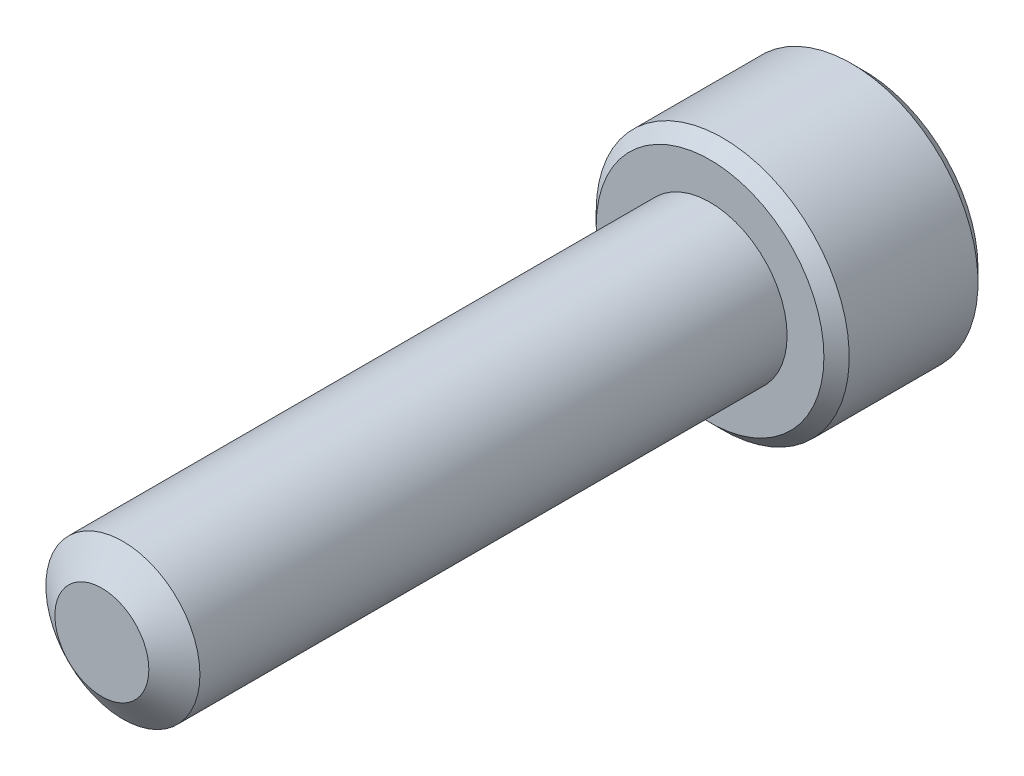
ISO-10303-21;
HEADER;
FILE_DESCRIPTION(('STEP AP214'),'2;1');
FILE_NAME('part.step','',(''),(''),'','','');
FILE_SCHEMA(('AUTOMOTIVE_DESIGN { 1 0 10303 214 1 1 1 1 }'));
ENDSEC;
DATA;
#1=APPLICATION_CONTEXT('core data for automotive mechanical design processes');
#2=APPLICATION_PROTOCOL_DEFINITION('international standard','automotive_design',2000,#1);
#3=PRODUCT_CONTEXT('',#1,'mechanical');
#4=PRODUCT('Part','Part','',(#3));
#5=PRODUCT_RELATED_PRODUCT_CATEGORY('part','',(#4));
#6=PRODUCT_DEFINITION_FORMATION('','',#4);
#7=PRODUCT_DEFINITION_CONTEXT('part definition',#1,'design');
#8=PRODUCT_DEFINITION('design','',#6,#7);
#9=PRODUCT_DEFINITION_SHAPE('','',#8);
#10=(LENGTH_UNIT() NAMED_UNIT(*) SI_UNIT(.MILLI.,.METRE.));
#11=(NAMED_UNIT(*) PLANE_ANGLE_UNIT() SI_UNIT($,.RADIAN.));
#12=(NAMED_UNIT(*) SI_UNIT($,.STERADIAN.) SOLID_ANGLE_UNIT());
#13=UNCERTAINTY_MEASURE_WITH_UNIT(LENGTH_MEASURE(1.E-05),#10,'distance_accuracy_value','');
#14=(GEOMETRIC_REPRESENTATION_CONTEXT(3) GLOBAL_UNCERTAINTY_ASSIGNED_CONTEXT((#13)) GLOBAL_UNIT_ASSIGNED_CONTEXT((#10,
#11,#12)) REPRESENTATION_CONTEXT('',''));
#15=CARTESIAN_POINT('',(0.,0.,0.));
#16=DIRECTION('',(0.,0.,1.));
#17=DIRECTION('',(1.,0.,0.));
#18=AXIS2_PLACEMENT_3D('',#15,#16,#17);
#19=CARTESIAN_POINT('',(0.,0.,-19.05));
#20=DIRECTION('',(0.,0.,1.));
#21=DIRECTION('',(1.,0.,0.));
#22=AXIS2_PLACEMENT_3D('',#19,#20,#21);
#23=CYLINDRICAL_SURFACE('',#22,2.413);
#24=CARTESIAN_POINT('',(0.,0.,-19.05));
#25=DIRECTION('',(0.,0.,-1.));
#26=DIRECTION('',(-1.,0.,0.));
#27=AXIS2_PLACEMENT_3D('',#24,#25,#26);
#28=CIRCLE('',#27,2.413);
#29=CARTESIAN_POINT('',(2.413,0.,-19.05));
#30=VERTEX_POINT('',#29);
#31=EDGE_CURVE('E236',#30,#30,#28,.F.);
#32=CARTESIAN_POINT('',(0.,0.,-0.659180743038974));
#33=DIRECTION('',(0.,0.,1.));
#34=DIRECTION('',(1.,0.,0.));
#35=AXIS2_PLACEMENT_3D('',#32,#33,#34);
#36=CIRCLE('',#35,2.413);
#37=CARTESIAN_POINT('',(2.413,0.,-0.659180743038973));
#38=VERTEX_POINT('',#37);
#39=EDGE_CURVE('E125',#38,#38,#36,.T.);
#40=CARTESIAN_POINT('',(2.413,0.,-19.05));
#41=CARTESIAN_POINT('',(2.413,0.,-18.8584289660733));
#42=CARTESIAN_POINT('',(2.413,0.,-18.6668579321466));
#43=CARTESIAN_POINT('',(2.413,0.,-18.2837158642933));
#44=CARTESIAN_POINT('',(2.413,0.,-18.0921448303666));
#45=CARTESIAN_POINT('',(2.413,0.,-17.7090027625133));
#46=CARTESIAN_POINT('',(2.413,0.,-17.5174317285866));
#47=CARTESIAN_POINT('',(2.413,0.,-17.1342896607332));
#48=CARTESIAN_POINT('',(2.413,0.,-16.9427186268065));
#49=CARTESIAN_POINT('',(2.413,0.,-16.5595765589532));
#50=CARTESIAN_POINT('',(2.413,0.,-16.3680055250265));
#51=CARTESIAN_POINT('',(2.413,0.,-15.9848634571732));
#52=CARTESIAN_POINT('',(2.413,0.,-15.7932924232465));
#53=CARTESIAN_POINT('',(2.413,0.,-15.4101503553931));
#54=CARTESIAN_POINT('',(2.413,0.,-15.2185793214665));
#55=CARTESIAN_POINT('',(2.413,0.,-14.8354372536131));
#56=CARTESIAN_POINT('',(2.413,0.,-14.6438662196864));
#57=CARTESIAN_POINT('',(2.413,0.,-14.2607241518331));
#58=CARTESIAN_POINT('',(2.413,0.,-14.0691531179064));
#59=CARTESIAN_POINT('',(2.413,0.,-13.686011050053));
#60=CARTESIAN_POINT('',(2.413,0.,-13.4944400161264));
#61=CARTESIAN_POINT('',(2.413,0.,-13.111297948273));
#62=CARTESIAN_POINT('',(2.413,0.,-12.9197269143463));
#63=CARTESIAN_POINT('',(2.413,0.,-12.536584846493));
#64=CARTESIAN_POINT('',(2.413,0.,-12.3450138125663));
#65=CARTESIAN_POINT('',(2.413,0.,-11.9618717447129));
#66=CARTESIAN_POINT('',(2.413,0.,-11.7703007107863));
#67=CARTESIAN_POINT('',(2.413,0.,-11.3871586429329));
#68=CARTESIAN_POINT('',(2.413,0.,-11.1955876090062));
#69=CARTESIAN_POINT('',(2.413,0.,-10.8124455411529));
#70=CARTESIAN_POINT('',(2.413,0.,-10.6208745072262));
#71=CARTESIAN_POINT('',(2.413,0.,-10.2377324393728));
#72=CARTESIAN_POINT('',(2.413,0.,-10.0461614054462));
#73=CARTESIAN_POINT('',(2.413,0.,-9.66301933759281));
#74=CARTESIAN_POINT('',(2.413,0.,-9.47144830366613));
#75=CARTESIAN_POINT('',(2.413,0.,-9.08830623581278));
#76=CARTESIAN_POINT('',(2.413,0.,-8.8967352018861));
#77=CARTESIAN_POINT('',(2.413,0.,-8.51359313403274));
#78=CARTESIAN_POINT('',(2.413,0.,-8.32202210010607));
#79=CARTESIAN_POINT('',(2.413,0.,-7.93888003225271));
#80=CARTESIAN_POINT('',(2.413,0.,-7.74730899832604));
#81=CARTESIAN_POINT('',(2.413,0.,-7.36416693047268));
#82=CARTESIAN_POINT('',(2.413,0.,-7.172595896546));
#83=CARTESIAN_POINT('',(2.413,0.,-6.78945382869265));
#84=CARTESIAN_POINT('',(2.413,0.,-6.59788279476597));
#85=CARTESIAN_POINT('',(2.413,0.,-6.21474072691262));
#86=CARTESIAN_POINT('',(2.413,0.,-6.02316969298594));
#87=CARTESIAN_POINT('',(2.413,0.,-5.64002762513258));
#88=CARTESIAN_POINT('',(2.413,0.,-5.44845659120591));
#89=CARTESIAN_POINT('',(2.413,0.,-5.06531452335255));
#90=CARTESIAN_POINT('',(2.413,0.,-4.87374348942588));
#91=CARTESIAN_POINT('',(2.413,0.,-4.49060142157252));
#92=CARTESIAN_POINT('',(2.413,0.,-4.29903038764584));
#93=CARTESIAN_POINT('',(2.413,0.,-3.91588831979249));
#94=CARTESIAN_POINT('',(2.413,0.,-3.72431728586581));
#95=CARTESIAN_POINT('',(2.413,0.,-3.34117521801246));
#96=CARTESIAN_POINT('',(2.413,0.,-3.14960418408578));
#97=CARTESIAN_POINT('',(2.413,0.,-2.76646211623243));
#98=CARTESIAN_POINT('',(2.413,0.,-2.57489108230575));
#99=CARTESIAN_POINT('',(2.413,0.,-2.19174901445239));
#100=CARTESIAN_POINT('',(2.413,0.,-2.00017798052571));
#101=CARTESIAN_POINT('',(2.413,0.,-1.61703591267236));
#102=CARTESIAN_POINT('',(2.413,0.,-1.42546487874568));
#103=CARTESIAN_POINT('',(2.413,0.,-1.04232281089233));
#104=CARTESIAN_POINT('',(2.413,0.,-0.850751776965651));
#105=CARTESIAN_POINT('',(2.413,0.,-0.659180743038973));
#106=B_SPLINE_CURVE_WITH_KNOTS('',3,(#40,#41,#42,#43,#44,#45,#46,#47,#48,#49,#50,#51,#52,#53,
#54,#55,#56,#57,#58,#59,#60,#61,#62,#63,#64,#65,#66,#67,#68,#69,#70,#71,#72,#73,#74,#75,#76,#77,
#78,#79,#80,#81,#82,#83,#84,#85,#86,#87,#88,#89,#90,#91,#92,#93,#94,#95,#96,#97,#98,#99,#100,
#101,#102,#103,#104,#105),.UNSPECIFIED.,.F.,.F.,(4,2,2,2,2,2,2,2,2,2,2,2,2,2,2,2,2,2,2,2,2,2,2,
2,2,2,2,2,2,2,2,2,4),(0.,0.57471310178003,1.14942620356006,1.72413930534009,2.29885240712013,
2.87356550890016,3.44827861068019,4.02299171246022,4.59770481424025,5.17241791602029,
5.74713101780032,6.32184411958035,6.89655722136038,7.47127032314042,8.04598342492045,
8.62069652670048,9.19540962848051,9.77012273026054,10.3448358320406,10.9195489338206,
11.4942620356006,12.0689751373807,12.6436882391607,13.2184013409407,13.7931144427208,
14.3678275445008,14.9425406462808,15.5172537480609,16.0919668498409,16.6666799516209,
17.241393053401,17.816106155181,18.390819256961),.UNSPECIFIED.);
#107=EDGE_CURVE('BSEAM40',#30,#38,#106,.T.);
#108=ORIENTED_EDGE('',*,*,#31,.T.);
#109=ORIENTED_EDGE('',*,*,#39,.F.);
#110=ORIENTED_EDGE('',*,*,#107,.T.);
#111=ORIENTED_EDGE('',*,*,#107,.F.);
#112=EDGE_LOOP('',(#108,#110,#109,#111));
#113=FACE_BOUND('',#112,.T.);
#114=ADVANCED_FACE('F40',(#113),#23,.T.);
#115=CARTESIAN_POINT('',(0.,0.,0.));
#116=DIRECTION('',(0.,0.,-1.));
#117=DIRECTION('',(-1.,0.,0.));
#118=AXIS2_PLACEMENT_3D('',#115,#116,#117);
#119=CONICAL_SURFACE('',#118,1.4715923357461,0.959931088596884);
#120=ORIENTED_EDGE('',*,*,#39,.T.);
#121=EDGE_LOOP('',(#120));
#122=FACE_BOUND('',#121,.T.);
#123=CARTESIAN_POINT('',(0.,0.,0.));
#124=DIRECTION('',(0.,0.,1.));
#125=DIRECTION('',(1.,0.,0.));
#126=AXIS2_PLACEMENT_3D('',#123,#124,#125);
#127=CIRCLE('',#126,1.4715923357461);
#128=CARTESIAN_POINT('',(1.4715923357461,0.,0.));
#129=VERTEX_POINT('',#128);
#130=EDGE_CURVE('E234',#129,#129,#127,.T.);
#131=ORIENTED_EDGE('',*,*,#130,.F.);
#132=EDGE_LOOP('',(#131));
#133=FACE_BOUND('',#132,.T.);
#134=ADVANCED_FACE('F217',(#122,#133),#119,.T.);
#135=CARTESIAN_POINT('',(0.,0.,0.));
#136=DIRECTION('',(0.,0.,1.));
#137=DIRECTION('',(1.,0.,0.));
#138=AXIS2_PLACEMENT_3D('',#135,#136,#137);
#139=PLANE('',#138);
#140=ORIENTED_EDGE('',*,*,#130,.T.);
#141=EDGE_LOOP('',(#140));
#142=FACE_BOUND('',#141,.T.);
#143=ADVANCED_FACE('F214',(#142),#139,.T.);
#144=CARTESIAN_POINT('',(0.,0.,-23.876));
#145=DIRECTION('',(0.,0.,1.));
#146=DIRECTION('',(1.,0.,0.));
#147=AXIS2_PLACEMENT_3D('',#144,#145,#146);
#148=CYLINDRICAL_SURFACE('',#147,3.9624);
#149=CARTESIAN_POINT('',(0.,0.,-23.47976));
#150=DIRECTION('',(0.,0.,-1.));
#151=DIRECTION('',(-1.,0.,0.));
#152=AXIS2_PLACEMENT_3D('',#149,#150,#151);
#153=CIRCLE('',#152,3.9624);
#154=CARTESIAN_POINT('',(-3.9624,0.,-23.47976));
#155=VERTEX_POINT('',#154);
#156=EDGE_CURVE('E49',#155,#155,#153,.F.);
#157=ORIENTED_EDGE('',*,*,#156,.T.);
#158=EDGE_LOOP('',(#157));
#159=FACE_BOUND('',#158,.T.);
#160=CARTESIAN_POINT('',(0.,0.,-19.44624));
#161=DIRECTION('',(0.,0.,-1.));
#162=DIRECTION('',(-1.,0.,0.));
#163=AXIS2_PLACEMENT_3D('',#160,#161,#162);
#164=CIRCLE('',#163,3.9624);
#165=CARTESIAN_POINT('',(-3.9624,0.,-19.44624));
#166=VERTEX_POINT('',#165);
#167=EDGE_CURVE('E190',#166,#166,#164,.T.);
#168=ORIENTED_EDGE('',*,*,#167,.T.);
#169=EDGE_LOOP('',(#168));
#170=FACE_BOUND('',#169,.T.);
#171=ADVANCED_FACE('F198',(#159,#170),#148,.T.);
#172=CARTESIAN_POINT('',(0.,0.,-23.876));
#173=DIRECTION('',(0.,0.,-1.));
#174=DIRECTION('',(-1.,0.,0.));
#175=AXIS2_PLACEMENT_3D('',#172,#173,#174);
#176=PLANE('',#175);
#177=CARTESIAN_POINT('',(0.,0.,-23.876));
#178=DIRECTION('',(0.,0.,-1.));
#179=DIRECTION('',(-1.,0.,0.));
#180=AXIS2_PLACEMENT_3D('',#177,#178,#179);
#181=CIRCLE('',#180,3.56616);
#182=CARTESIAN_POINT('',(-3.56616,0.,-23.876));
#183=VERTEX_POINT('',#182);
#184=EDGE_CURVE('E124',#183,#183,#181,.T.);
#185=ORIENTED_EDGE('',*,*,#184,.T.);
#186=EDGE_LOOP('',(#185));
#187=FACE_BOUND('',#186,.T.);
#188=CARTESIAN_POINT('',(0.,0.,-23.876));
#189=DIRECTION('',(0.,0.,-1.));
#190=DIRECTION('',(-1.,0.,0.));
#191=AXIS2_PLACEMENT_3D('',#188,#189,#190);
#192=CIRCLE('',#191,2.29135888084633);
#193=CARTESIAN_POINT('',(-1.984375,1.14567944042316,-23.876));
#194=VERTEX_POINT('',#193);
#195=CARTESIAN_POINT('',(0.,2.29135888084633,-23.876));
#196=VERTEX_POINT('',#195);
#197=EDGE_CURVE('E104',#194,#196,#192,.T.);
#198=ORIENTED_EDGE('',*,*,#197,.F.);
#199=CARTESIAN_POINT('',(-1.984375,-1.14567944042316,-23.876));
#200=VERTEX_POINT('',#199);
#201=EDGE_CURVE('E55',#200,#194,#192,.T.);
#202=ORIENTED_EDGE('',*,*,#201,.F.);
#203=CARTESIAN_POINT('',(0.,-2.29135888084633,-23.876));
#204=VERTEX_POINT('',#203);
#205=EDGE_CURVE('E303',#204,#200,#192,.T.);
#206=ORIENTED_EDGE('',*,*,#205,.F.);
#207=CARTESIAN_POINT('',(1.984375,-1.14567944042316,-23.876));
#208=VERTEX_POINT('',#207);
#209=EDGE_CURVE('E65',#208,#204,#192,.T.);
#210=ORIENTED_EDGE('',*,*,#209,.F.);
#211=CARTESIAN_POINT('',(1.984375,1.14567944042316,-23.876));
#212=VERTEX_POINT('',#211);
#213=EDGE_CURVE('E147',#212,#208,#192,.T.);
#214=ORIENTED_EDGE('',*,*,#213,.F.);
#215=EDGE_CURVE('E113',#196,#212,#192,.T.);
#216=ORIENTED_EDGE('',*,*,#215,.F.);
#217=EDGE_LOOP('',(#198,#202,#206,#210,#214,#216));
#218=FACE_BOUND('',#217,.T.);
#219=ADVANCED_FACE('F146',(#187,#218),#176,.T.);
#220=CARTESIAN_POINT('',(0.,0.,-19.05));
#221=DIRECTION('',(0.,0.,-1.));
#222=DIRECTION('',(-1.,0.,0.));
#223=AXIS2_PLACEMENT_3D('',#220,#221,#222);
#224=PLANE('',#223);
#225=CARTESIAN_POINT('',(0.,0.,-19.05));
#226=DIRECTION('',(0.,0.,-1.));
#227=DIRECTION('',(-1.,0.,0.));
#228=AXIS2_PLACEMENT_3D('',#225,#226,#227);
#229=CIRCLE('',#228,3.56616);
#230=CARTESIAN_POINT('',(-3.56616,0.,-19.05));
#231=VERTEX_POINT('',#230);
#232=EDGE_CURVE('E11',#231,#231,#229,.F.);
#233=ORIENTED_EDGE('',*,*,#232,.T.);
#234=EDGE_LOOP('',(#233));
#235=FACE_BOUND('',#234,.T.);
#236=ORIENTED_EDGE('',*,*,#31,.F.);
#237=EDGE_LOOP('',(#236));
#238=FACE_BOUND('',#237,.T.);
#239=ADVANCED_FACE('F207',(#235,#238),#224,.F.);
#240=CARTESIAN_POINT('',(0.,0.,-23.876));
#241=DIRECTION('',(0.,0.,-1.));
#242=DIRECTION('',(-1.,0.,0.));
#243=AXIS2_PLACEMENT_3D('',#240,#241,#242);
#244=CONICAL_SURFACE('',#243,2.29135888084633,0.78539816339745);
#245=ORIENTED_EDGE('',*,*,#215,.T.);
#246=CARTESIAN_POINT('',(-0.000199999999999771,2.29147435090016,-23.8761154787818));
#247=CARTESIAN_POINT('',(0.0680159951668028,2.25208982772757,-23.8367628522639));
#248=CARTESIAN_POINT('',(0.137372685106966,2.21204672412052,-23.7997213104462));
#249=CARTESIAN_POINT('',(0.278798800452187,2.13039431835551,-23.7318988584233));
#250=CARTESIAN_POINT('',(0.350881678736782,2.08877724917394,-23.7011556890918));
#251=CARTESIAN_POINT('',(0.496233397266003,2.00485839535392,-23.6484918888112));
#252=CARTESIAN_POINT('',(0.569465212486937,1.96257798712287,-23.62643887588));
#253=CARTESIAN_POINT('',(0.717541182594705,1.87708628592063,-23.5924614929439));
#254=CARTESIAN_POINT('',(0.792380812753423,1.83387760530244,-23.5805117560917));
#255=CARTESIAN_POINT('',(0.921360414543814,1.75941119748879,-23.5697300990819));
#256=CARTESIAN_POINT('',(0.975333715772441,1.72824969749539,-23.5681338990591));
#257=CARTESIAN_POINT('',(1.0831921185198,1.66597761963484,-23.5708218388653));
#258=CARTESIAN_POINT('',(1.13707718248552,1.63486706344893,-23.5751080403405));
#259=CARTESIAN_POINT('',(1.2443385382486,1.57293969082547,-23.5893168730135));
#260=CARTESIAN_POINT('',(1.29771419276014,1.54212324232506,-23.5992458104523));
#261=CARTESIAN_POINT('',(1.40354251740889,1.48102323060122,-23.6241950842745));
#262=CARTESIAN_POINT('',(1.4559952579711,1.45073962671789,-23.6392150303895));
#263=CARTESIAN_POINT('',(1.59035733896365,1.37316564308797,-23.6838078516357));
#264=CARTESIAN_POINT('',(1.67143335715832,1.32635638215845,-23.7167429959383));
#265=CARTESIAN_POINT('',(1.79064830672984,1.25752759893191,-23.7723424412022));
#266=CARTESIAN_POINT('',(1.829934924386,1.23484545965257,-23.7918775920519));
#267=CARTESIAN_POINT('',(1.90778036186805,1.18990137536713,-23.8327287381194));
#268=CARTESIAN_POINT('',(1.9463396111017,1.16763918244233,-23.8540436395684));
#269=CARTESIAN_POINT('',(1.984575,1.14556397036933,-23.8761154787818));
#270=B_SPLINE_CURVE_WITH_KNOTS('',3,(#246,#247,#248,#249,#250,#251,#252,#253,#254,#255,#256,
#257,#258,#259,#260,#261,#262,#263,#264,#265,#266,#267,#268,#269),.UNSPECIFIED.,.F.,.F.,(4,2,2,
2,2,2,2,2,2,2,2,4),(0.,0.264339630306627,0.530219665093693,0.791876416371459,1.05287424418109,
1.239639843932,1.42647091743852,1.61351120244034,1.8005371524754,2.09764209964316,
2.24579179873713,2.39385111134157),.UNSPECIFIED.);
#271=EDGE_CURVE('E118',#196,#212,#270,.T.);
#272=ORIENTED_EDGE('',*,*,#271,.F.);
#273=EDGE_LOOP('',(#245,#272));
#274=FACE_BOUND('',#273,.T.);
#275=ADVANCED_FACE('F119',(#274),#244,.F.);
#276=ORIENTED_EDGE('',*,*,#213,.T.);
#277=CARTESIAN_POINT('',(1.984375,-2.28495242157823,-24.6109840788166));
#278=CARTESIAN_POINT('',(1.984375,-2.22931635455402,-24.5689866855508));
#279=CARTESIAN_POINT('',(1.984375,-2.17336876548389,-24.5273960540763));
#280=CARTESIAN_POINT('',(1.984375,-2.06072770258171,-24.4452084614715));
#281=CARTESIAN_POINT('',(1.984375,-2.00403404503435,-24.404611752405));
#282=CARTESIAN_POINT('',(1.984375,-1.88936329173489,-24.3243035031747));
#283=CARTESIAN_POINT('',(1.984375,-1.83137965519348,-24.2846012588133));
#284=CARTESIAN_POINT('',(1.984375,-1.7144280213784,-24.2066851734013));
#285=CARTESIAN_POINT('',(1.984375,-1.65546009407228,-24.1684712271944));
#286=CARTESIAN_POINT('',(1.984375,-1.47005472306036,-24.0522528340136));
#287=CARTESIAN_POINT('',(1.984375,-1.34163909427884,-23.9773478868724));
#288=CARTESIAN_POINT('',(1.984375,-1.0784038470548,-23.8403302154397));
#289=CARTESIAN_POINT('',(1.984375,-0.943607781407426,-23.7781743664824));
#290=CARTESIAN_POINT('',(1.984375,-0.741275100444882,-23.7021325786886));
#291=CARTESIAN_POINT('',(1.984375,-0.676735408881095,-23.680308061326));
#292=CARTESIAN_POINT('',(1.984375,-0.546098118112762,-23.6418404635378));
#293=CARTESIAN_POINT('',(1.984375,-0.480000411919956,-23.6251977400655));
#294=CARTESIAN_POINT('',(1.984375,-0.347746170028533,-23.5982353808697));
#295=CARTESIAN_POINT('',(1.984375,-0.281612071479124,-23.5878074097359));
#296=CARTESIAN_POINT('',(1.984375,-0.148636620052352,-23.5734781473766));
#297=CARTESIAN_POINT('',(1.984375,-0.0817953907393255,-23.5695757342274));
#298=CARTESIAN_POINT('',(1.984375,0.0495156750890624,-23.5685870513327));
#299=CARTESIAN_POINT('',(1.984375,0.113983775102989,-23.571259178875));
#300=CARTESIAN_POINT('',(1.984375,0.242367515846175,-23.5827392104975));
#301=CARTESIAN_POINT('',(1.984375,0.306283102295918,-23.5915477106392));
#302=CARTESIAN_POINT('',(1.984375,0.434181040262183,-23.6149690213329));
#303=CARTESIAN_POINT('',(1.984375,0.498145026858309,-23.6296806062321));
#304=CARTESIAN_POINT('',(1.984375,0.624675616953007,-23.6641261814121));
#305=CARTESIAN_POINT('',(1.984375,0.687242336899688,-23.6838597514492));
#306=CARTESIAN_POINT('',(1.984375,0.884225483826088,-23.7534122372308));
#307=CARTESIAN_POINT('',(1.984375,1.01583674256468,-23.8111524112565));
#308=CARTESIAN_POINT('',(1.984375,1.27288659242652,-23.9395303365888));
#309=CARTESIAN_POINT('',(1.984375,1.3983008827048,-24.0102144249194));
#310=CARTESIAN_POINT('',(1.984375,1.57956687990221,-24.1205166638132));
#311=CARTESIAN_POINT('',(1.984375,1.63738271299424,-24.1569698294754));
#312=CARTESIAN_POINT('',(1.984375,1.75202215386202,-24.2314159632917));
#313=CARTESIAN_POINT('',(1.984375,1.80884568601362,-24.2694090480781));
#314=CARTESIAN_POINT('',(1.984375,1.92116923084255,-24.3463388088931));
#315=CARTESIAN_POINT('',(1.984375,1.97667624512253,-24.3852653130388));
#316=CARTESIAN_POINT('',(1.984375,2.08693170717166,-24.4641477461214));
#317=CARTESIAN_POINT('',(1.984375,2.14168035934792,-24.504103389024));
#318=CARTESIAN_POINT('',(1.984375,2.19611149046622,-24.5444806112854));
#319=B_SPLINE_CURVE_WITH_KNOTS('',3,(#277,#278,#279,#280,#281,#282,#283,#284,#285,#286,#287,
#288,#289,#290,#291,#292,#293,#294,#295,#296,#297,#298,#299,#300,#301,#302,#303,#304,#305,#306,
#307,#308,#309,#310,#311,#312,#313,#314,#315,#316,#317,#318),.UNSPECIFIED.,.F.,.F.,(4,2,2,2,2,2,
2,2,2,2,2,2,2,2,2,2,2,2,2,2,4),(0.,0.209126070008322,0.418304637356571,0.629103979977991,
0.839888401371184,1.28549951116127,1.72957750768351,1.93379389749972,2.13802435186698,
2.33858179514334,2.53910475350639,2.73236963400794,2.92565329006887,3.12231577097488,
3.31896180041345,3.74886295245172,4.18033428125363,4.3853601718029,4.59040161996383,
4.79377749165108,4.99709743524131),.UNSPECIFIED.);
#320=EDGE_CURVE('E112',#212,#208,#319,.F.);
#321=ORIENTED_EDGE('',*,*,#320,.F.);
#322=EDGE_LOOP('',(#276,#321));
#323=FACE_BOUND('',#322,.T.);
#324=ADVANCED_FACE('F312',(#323),#244,.F.);
#325=ORIENTED_EDGE('',*,*,#209,.T.);
#326=CARTESIAN_POINT('',(1.984575,-1.14556397036933,-23.8761154787818));
#327=CARTESIAN_POINT('',(1.9163590048332,-1.18494849354192,-23.8367628522639));
#328=CARTESIAN_POINT('',(1.84700231489303,-1.22499159714897,-23.7997213104462));
#329=CARTESIAN_POINT('',(1.70557619954781,-1.30664400291398,-23.7318988584233));
#330=CARTESIAN_POINT('',(1.63349332126322,-1.34826107209555,-23.7011556890918));
#331=CARTESIAN_POINT('',(1.488141602734,-1.43217992591557,-23.6484918888112));
#332=CARTESIAN_POINT('',(1.41490978751306,-1.47446033414662,-23.62643887588));
#333=CARTESIAN_POINT('',(1.2668338174053,-1.55995203534886,-23.5924614929439));
#334=CARTESIAN_POINT('',(1.19199418724658,-1.60316071596705,-23.5805117560917));
#335=CARTESIAN_POINT('',(1.06301458545619,-1.6776271237807,-23.5697300990819));
#336=CARTESIAN_POINT('',(1.00904128422756,-1.7087886237741,-23.5681338990591));
#337=CARTESIAN_POINT('',(0.901182881480201,-1.77106070163465,-23.5708218388653));
#338=CARTESIAN_POINT('',(0.847297817514478,-1.80217125782056,-23.5751080403405));
#339=CARTESIAN_POINT('',(0.740036461751398,-1.86409863044402,-23.5893168730135));
#340=CARTESIAN_POINT('',(0.686660807239861,-1.89491507894443,-23.5992458104523));
#341=CARTESIAN_POINT('',(0.580832482591105,-1.95601509066827,-23.6241950842745));
#342=CARTESIAN_POINT('',(0.5283797420289,-1.9862986945516,-23.6392150303895));
#343=CARTESIAN_POINT('',(0.394017661036353,-2.06387267818152,-23.6838078516357));
#344=CARTESIAN_POINT('',(0.312941642841678,-2.11068193911104,-23.7167429959383));
#345=CARTESIAN_POINT('',(0.193726693270162,-2.17951072233758,-23.7723424412022));
#346=CARTESIAN_POINT('',(0.154440075614,-2.20219286161692,-23.7918775920519));
#347=CARTESIAN_POINT('',(0.0765946381319483,-2.24713694590237,-23.8327287381194));
#348=CARTESIAN_POINT('',(0.0380353888983022,-2.26939913882716,-23.8540436395684));
#349=CARTESIAN_POINT('',(-0.000199999999999163,-2.29147435090017,-23.8761154787818));
#350=B_SPLINE_CURVE_WITH_KNOTS('',3,(#326,#327,#328,#329,#330,#331,#332,#333,#334,#335,#336,
#337,#338,#339,#340,#341,#342,#343,#344,#345,#346,#347,#348,#349),.UNSPECIFIED.,.F.,.F.,(4,2,2,
2,2,2,2,2,2,2,2,4),(0.,0.264339630306625,0.530219665093692,0.791876416371457,1.05287424418109,
1.239639843932,1.42647091743852,1.61351120244034,1.8005371524754,2.09764209964316,
2.24579179873713,2.39385111134157),.UNSPECIFIED.);
#351=EDGE_CURVE('E159',#208,#204,#350,.T.);
#352=ORIENTED_EDGE('',*,*,#351,.F.);
#353=EDGE_LOOP('',(#325,#352));
#354=FACE_BOUND('',#353,.T.);
#355=ADVANCED_FACE('F309',(#354),#244,.F.);
#356=ORIENTED_EDGE('',*,*,#205,.T.);
#357=CARTESIAN_POINT('',(0.000200000000000153,-2.29147435090017,-23.8761154787818));
#358=CARTESIAN_POINT('',(-0.0680159951668025,-2.25208982772757,-23.8367628522639));
#359=CARTESIAN_POINT('',(-0.137372685106966,-2.21204672412052,-23.7997213104462));
#360=CARTESIAN_POINT('',(-0.278798800452187,-2.13039431835551,-23.7318988584233));
#361=CARTESIAN_POINT('',(-0.350881678736782,-2.08877724917394,-23.7011556890918));
#362=CARTESIAN_POINT('',(-0.496233397266002,-2.00485839535392,-23.6484918888112));
#363=CARTESIAN_POINT('',(-0.569465212486937,-1.96257798712287,-23.62643887588));
#364=CARTESIAN_POINT('',(-0.717541182594704,-1.87708628592063,-23.5924614929439));
#365=CARTESIAN_POINT('',(-0.792380812753422,-1.83387760530244,-23.5805117560917));
#366=CARTESIAN_POINT('',(-0.921360414543813,-1.75941119748879,-23.5697300990819));
#367=CARTESIAN_POINT('',(-0.97533371577244,-1.72824969749539,-23.5681338990591));
#368=CARTESIAN_POINT('',(-1.0831921185198,-1.66597761963484,-23.5708218388653));
#369=CARTESIAN_POINT('',(-1.13707718248552,-1.63486706344893,-23.5751080403405));
#370=CARTESIAN_POINT('',(-1.2443385382486,-1.57293969082547,-23.5893168730135));
#371=CARTESIAN_POINT('',(-1.29771419276014,-1.54212324232506,-23.5992458104523));
#372=CARTESIAN_POINT('',(-1.40354251740889,-1.48102323060122,-23.6241950842745));
#373=CARTESIAN_POINT('',(-1.4559952579711,-1.45073962671789,-23.6392150303895));
#374=CARTESIAN_POINT('',(-1.59035733896365,-1.37316564308797,-23.6838078516357));
#375=CARTESIAN_POINT('',(-1.67143335715832,-1.32635638215845,-23.7167429959383));
#376=CARTESIAN_POINT('',(-1.79064830672984,-1.25752759893191,-23.7723424412022));
#377=CARTESIAN_POINT('',(-1.829934924386,-1.23484545965257,-23.7918775920519));
#378=CARTESIAN_POINT('',(-1.90778036186805,-1.18990137536713,-23.8327287381194));
#379=CARTESIAN_POINT('',(-1.9463396111017,-1.16763918244233,-23.8540436395684));
#380=CARTESIAN_POINT('',(-1.984575,-1.14556397036933,-23.8761154787818));
#381=B_SPLINE_CURVE_WITH_KNOTS('',3,(#357,#358,#359,#360,#361,#362,#363,#364,#365,#366,#367,
#368,#369,#370,#371,#372,#373,#374,#375,#376,#377,#378,#379,#380),.UNSPECIFIED.,.F.,.F.,(4,2,2,
2,2,2,2,2,2,2,2,4),(0.,0.264339630306627,0.530219665093693,0.791876416371457,1.05287424418109,
1.239639843932,1.42647091743852,1.61351120244034,1.8005371524754,2.09764209964316,
2.24579179873713,2.39385111134157),.UNSPECIFIED.);
#382=EDGE_CURVE('E281',#204,#200,#381,.T.);
#383=ORIENTED_EDGE('',*,*,#382,.F.);
#384=EDGE_LOOP('',(#356,#383));
#385=FACE_BOUND('',#384,.T.);
#386=ADVANCED_FACE('F318',(#385),#244,.F.);
#387=ORIENTED_EDGE('',*,*,#201,.T.);
#388=CARTESIAN_POINT('',(-1.984375,-2.28495242191067,-24.6109840790676));
#389=CARTESIAN_POINT('',(-1.984375,-2.22931635487714,-24.5689866857921));
#390=CARTESIAN_POINT('',(-1.984375,-2.17336876579765,-24.527396054308));
#391=CARTESIAN_POINT('',(-1.984375,-2.06072770287666,-24.4452084616839));
#392=CARTESIAN_POINT('',(-1.984375,-2.00403404531985,-24.4046117526079));
#393=CARTESIAN_POINT('',(-1.984375,-1.88936329200117,-24.3243035033582));
#394=CARTESIAN_POINT('',(-1.984375,-1.83137965544999,-24.2846012589872));
#395=CARTESIAN_POINT('',(-1.984375,-1.71442802161519,-24.206685173556));
#396=CARTESIAN_POINT('',(-1.984375,-1.65546009429911,-24.1684712273396));
#397=CARTESIAN_POINT('',(-1.984375,-1.47005472325436,-24.0522528341287));
#398=CARTESIAN_POINT('',(-1.984375,-1.34163909444949,-23.9773478869673));
#399=CARTESIAN_POINT('',(-1.984375,-1.07840384717678,-23.8403302154972));
#400=CARTESIAN_POINT('',(-1.984375,-0.943607781504097,-23.7781743665226));
#401=CARTESIAN_POINT('',(-1.984375,-0.741275100522509,-23.702132578716));
#402=CARTESIAN_POINT('',(-1.984375,-0.676735408966697,-23.6803080613539));
#403=CARTESIAN_POINT('',(-1.984375,-0.546098118214576,-23.6418404635651));
#404=CARTESIAN_POINT('',(-1.984375,-0.480000412030006,-23.6251977400917));
#405=CARTESIAN_POINT('',(-1.984375,-0.347746170154783,-23.5982353808918));
#406=CARTESIAN_POINT('',(-1.984375,-0.281612071613335,-23.587807409755));
#407=CARTESIAN_POINT('',(-1.984375,-0.148636620202218,-23.5734781473881));
#408=CARTESIAN_POINT('',(-1.984375,-0.0817953908968865,-23.5695757342341));
#409=CARTESIAN_POINT('',(-1.984375,0.0495156749173046,-23.5685870513286));
#410=CARTESIAN_POINT('',(-1.984375,0.113983774924709,-23.571259178865));
#411=CARTESIAN_POINT('',(-1.984375,0.242367515655503,-23.5827392104746));
#412=CARTESIAN_POINT('',(-1.984375,0.306283102099376,-23.5915477106094));
#413=CARTESIAN_POINT('',(-1.984375,0.434181040054053,-23.6149690212885));
#414=CARTESIAN_POINT('',(-1.984375,0.498145026644478,-23.6296806061801));
#415=CARTESIAN_POINT('',(-1.984375,0.624675616728326,-23.6641261813447));
#416=CARTESIAN_POINT('',(-1.984375,0.687242336669858,-23.683859751374));
#417=CARTESIAN_POINT('',(-1.984375,0.884225483546212,-23.7534122371189));
#418=CARTESIAN_POINT('',(-1.984375,1.01583674224242,-23.8111524111108));
#419=CARTESIAN_POINT('',(-1.984375,1.27288659202273,-23.9395303363718));
#420=CARTESIAN_POINT('',(-1.984375,1.3983008822619,-24.0102144246649));
#421=CARTESIAN_POINT('',(-1.984375,1.57956687940504,-24.1205166635036));
#422=CARTESIAN_POINT('',(-1.984375,1.63738271248118,-24.1569698291489));
#423=CARTESIAN_POINT('',(-1.984375,1.75202215331742,-24.2314159629313));
#424=CARTESIAN_POINT('',(-1.984375,1.80884568545336,-24.2694090477007));
#425=CARTESIAN_POINT('',(-1.984375,1.92116923025136,-24.3463388084819));
#426=CARTESIAN_POINT('',(-1.984375,1.97667624451606,-24.3852653126108));
#427=CARTESIAN_POINT('',(-1.984375,2.08693170653473,-24.4641477456598));
#428=CARTESIAN_POINT('',(-1.984375,2.14168035869581,-24.5041033885457));
#429=CARTESIAN_POINT('',(-1.984375,2.19611148979895,-24.5444806107903));
#430=B_SPLINE_CURVE_WITH_KNOTS('',3,(#388,#389,#390,#391,#392,#393,#394,#395,#396,#397,#398,
#399,#400,#401,#402,#403,#404,#405,#406,#407,#408,#409,#410,#411,#412,#413,#414,#415,#416,#417,
#418,#419,#420,#421,#422,#423,#424,#425,#426,#427,#428,#429),.UNSPECIFIED.,.F.,.F.,(4,2,2,2,2,2,
2,2,2,2,2,2,2,2,2,2,2,2,2,2,4),(0.,0.209126070048129,0.418304637436191,0.629103980098179,
0.83988840153193,1.28549951141298,1.72957750802533,1.93379389781847,2.13802435216272,
2.33858179541699,2.53910475375796,2.7323696342393,2.92565329027999,3.12231577116422,
3.31896180058102,3.74886295246281,4.18033428110719,4.38536017158909,4.59040161968262,
4.7937774913034,4.99709743482717),.UNSPECIFIED.);
#431=EDGE_CURVE('E135',#200,#194,#430,.T.);
#432=ORIENTED_EDGE('',*,*,#431,.F.);
#433=EDGE_LOOP('',(#387,#432));
#434=FACE_BOUND('',#433,.T.);
#435=ADVANCED_FACE('F322',(#434),#244,.F.);
#436=ORIENTED_EDGE('',*,*,#197,.T.);
#437=CARTESIAN_POINT('',(-1.984575,1.14556397036933,-23.8761154787818));
#438=CARTESIAN_POINT('',(-1.9163590048332,1.18494849354192,-23.8367628522639));
#439=CARTESIAN_POINT('',(-1.84700231489303,1.22499159714897,-23.7997213104462));
#440=CARTESIAN_POINT('',(-1.70557619954781,1.30664400291398,-23.7318988584233));
#441=CARTESIAN_POINT('',(-1.63349332126322,1.34826107209555,-23.7011556890918));
#442=CARTESIAN_POINT('',(-1.488141602734,1.43217992591557,-23.6484918888112));
#443=CARTESIAN_POINT('',(-1.41490978751306,1.47446033414662,-23.62643887588));
#444=CARTESIAN_POINT('',(-1.2668338174053,1.55995203534886,-23.5924614929439));
#445=CARTESIAN_POINT('',(-1.19199418724658,1.60316071596705,-23.5805117560917));
#446=CARTESIAN_POINT('',(-1.06301458545619,1.6776271237807,-23.5697300990819));
#447=CARTESIAN_POINT('',(-1.00904128422756,1.7087886237741,-23.5681338990591));
#448=CARTESIAN_POINT('',(-0.901182881480202,1.77106070163465,-23.5708218388653));
#449=CARTESIAN_POINT('',(-0.847297817514479,1.80217125782056,-23.5751080403405));
#450=CARTESIAN_POINT('',(-0.740036461751398,1.86409863044402,-23.5893168730135));
#451=CARTESIAN_POINT('',(-0.686660807239862,1.89491507894443,-23.5992458104523));
#452=CARTESIAN_POINT('',(-0.580832482591106,1.95601509066827,-23.6241950842745));
#453=CARTESIAN_POINT('',(-0.528379742028901,1.9862986945516,-23.6392150303895));
#454=CARTESIAN_POINT('',(-0.394017661036353,2.06387267818152,-23.6838078516357));
#455=CARTESIAN_POINT('',(-0.312941642841677,2.11068193911104,-23.7167429959383));
#456=CARTESIAN_POINT('',(-0.193726693270162,2.17951072233758,-23.7723424412022));
#457=CARTESIAN_POINT('',(-0.154440075614001,2.20219286161692,-23.7918775920519));
#458=CARTESIAN_POINT('',(-0.0765946381319486,2.24713694590236,-23.8327287381194));
#459=CARTESIAN_POINT('',(-0.0380353888983016,2.26939913882716,-23.8540436395684));
#460=CARTESIAN_POINT('',(0.000200000000000925,2.29147435090016,-23.8761154787818));
#461=B_SPLINE_CURVE_WITH_KNOTS('',3,(#437,#438,#439,#440,#441,#442,#443,#444,#445,#446,#447,
#448,#449,#450,#451,#452,#453,#454,#455,#456,#457,#458,#459,#460),.UNSPECIFIED.,.F.,.F.,(4,2,2,
2,2,2,2,2,2,2,2,4),(0.,0.264339630306627,0.530219665093693,0.791876416371457,1.05287424418109,
1.239639843932,1.42647091743852,1.61351120244034,1.8005371524754,2.09764209964316,
2.24579179873713,2.39385111134157),.UNSPECIFIED.);
#462=EDGE_CURVE('E108',#194,#196,#461,.T.);
#463=ORIENTED_EDGE('',*,*,#462,.F.);
#464=EDGE_LOOP('',(#436,#463));
#465=FACE_BOUND('',#464,.T.);
#466=ADVANCED_FACE('F106',(#465),#244,.F.);
#467=CARTESIAN_POINT('',(1.984375,3.43703832126949,-20.8994375));
#468=DIRECTION('',(0.,0.,-1.));
#469=DIRECTION('',(-1.,0.,0.));
#470=AXIS2_PLACEMENT_3D('',#467,#468,#469);
#471=PLANE('',#470);
#472=DIRECTION('',(0.866025403784439,0.5,0.));
#473=VECTOR('',#472,1.);
#474=CARTESIAN_POINT('',(-1.984375,1.14567944042316,-20.8994375));
#475=LINE('',#474,#473);
#476=CARTESIAN_POINT('',(-1.984375,1.14567944042316,-20.8994375));
#477=VERTEX_POINT('',#476);
#478=CARTESIAN_POINT('',(0.,2.29135888084633,-20.8994375));
#479=VERTEX_POINT('',#478);
#480=EDGE_CURVE('E134',#477,#479,#475,.T.);
#481=ORIENTED_EDGE('',*,*,#480,.T.);
#482=DIRECTION('',(0.866025403784439,-0.5,0.));
#483=VECTOR('',#482,1.);
#484=CARTESIAN_POINT('',(0.,2.29135888084633,-20.8994375));
#485=LINE('',#484,#483);
#486=CARTESIAN_POINT('',(1.984375,1.14567944042316,-20.8994375));
#487=VERTEX_POINT('',#486);
#488=EDGE_CURVE('E139',#479,#487,#485,.T.);
#489=ORIENTED_EDGE('',*,*,#488,.T.);
#490=DIRECTION('',(0.,-1.,0.));
#491=VECTOR('',#490,1.);
#492=CARTESIAN_POINT('',(1.984375,1.14567944042316,-20.8994375));
#493=LINE('',#492,#491);
#494=CARTESIAN_POINT('',(1.984375,-1.14567944042316,-20.8994375));
#495=VERTEX_POINT('',#494);
#496=EDGE_CURVE('E267',#487,#495,#493,.T.);
#497=ORIENTED_EDGE('',*,*,#496,.T.);
#498=DIRECTION('',(-0.866025403784439,-0.5,0.));
#499=VECTOR('',#498,1.);
#500=CARTESIAN_POINT('',(1.984375,-1.14567944042316,-20.8994375));
#501=LINE('',#500,#499);
#502=CARTESIAN_POINT('',(0.,-2.29135888084633,-20.8994375));
#503=VERTEX_POINT('',#502);
#504=EDGE_CURVE('E263',#495,#503,#501,.T.);
#505=ORIENTED_EDGE('',*,*,#504,.T.);
#506=DIRECTION('',(-0.866025403784439,0.5,0.));
#507=VECTOR('',#506,1.);
#508=CARTESIAN_POINT('',(0.,-2.29135888084633,-20.8994375));
#509=LINE('',#508,#507);
#510=CARTESIAN_POINT('',(-1.984375,-1.14567944042316,-20.8994375));
#511=VERTEX_POINT('',#510);
#512=EDGE_CURVE('E259',#503,#511,#509,.T.);
#513=ORIENTED_EDGE('',*,*,#512,.T.);
#514=DIRECTION('',(0.,1.,0.));
#515=VECTOR('',#514,1.);
#516=CARTESIAN_POINT('',(-1.984375,-1.14567944042316,-20.8994375));
#517=LINE('',#516,#515);
#518=EDGE_CURVE('E143',#511,#477,#517,.T.);
#519=ORIENTED_EDGE('',*,*,#518,.T.);
#520=EDGE_LOOP('',(#481,#489,#497,#505,#513,#519));
#521=FACE_BOUND('',#520,.T.);
#522=ADVANCED_FACE('F178',(#521),#471,.T.);
#523=CARTESIAN_POINT('',(0.,2.29135888084633,-20.8994375));
#524=DIRECTION('',(0.5,0.866025403784439,0.));
#525=DIRECTION('',(-0.866025403784439,0.5,0.));
#526=AXIS2_PLACEMENT_3D('',#523,#524,#525);
#527=PLANE('',#526);
#528=DIRECTION('',(0.,0.,-1.));
#529=VECTOR('',#528,1.);
#530=CARTESIAN_POINT('',(0.,2.29135888084633,-20.8994375));
#531=LINE('',#530,#529);
#532=EDGE_CURVE('E131',#479,#196,#531,.T.);
#533=ORIENTED_EDGE('',*,*,#532,.T.);
#534=ORIENTED_EDGE('',*,*,#271,.T.);
#535=DIRECTION('',(0.,0.,-1.));
#536=VECTOR('',#535,1.);
#537=CARTESIAN_POINT('',(1.984375,1.14567944042316,-20.8994375));
#538=LINE('',#537,#536);
#539=EDGE_CURVE('E142',#487,#212,#538,.T.);
#540=ORIENTED_EDGE('',*,*,#539,.F.);
#541=ORIENTED_EDGE('',*,*,#488,.F.);
#542=EDGE_LOOP('',(#533,#534,#540,#541));
#543=FACE_BOUND('',#542,.T.);
#544=ADVANCED_FACE('F137',(#543),#527,.F.);
#545=CARTESIAN_POINT('',(1.984375,1.14567944042316,-20.8994375));
#546=DIRECTION('',(1.,0.,0.));
#547=DIRECTION('',(0.,0.,-1.));
#548=AXIS2_PLACEMENT_3D('',#545,#546,#547);
#549=PLANE('',#548);
#550=ORIENTED_EDGE('',*,*,#539,.T.);
#551=ORIENTED_EDGE('',*,*,#320,.T.);
#552=DIRECTION('',(0.,0.,-1.));
#553=VECTOR('',#552,1.);
#554=CARTESIAN_POINT('',(1.984375,-1.14567944042316,-20.8994375));
#555=LINE('',#554,#553);
#556=EDGE_CURVE('E243',#495,#208,#555,.T.);
#557=ORIENTED_EDGE('',*,*,#556,.F.);
#558=ORIENTED_EDGE('',*,*,#496,.F.);
#559=EDGE_LOOP('',(#550,#551,#557,#558));
#560=FACE_BOUND('',#559,.T.);
#561=ADVANCED_FACE('F167',(#560),#549,.F.);
#562=CARTESIAN_POINT('',(1.984375,-1.14567944042316,-20.8994375));
#563=DIRECTION('',(0.5,-0.866025403784439,0.));
#564=DIRECTION('',(0.866025403784439,0.5,0.));
#565=AXIS2_PLACEMENT_3D('',#562,#563,#564);
#566=PLANE('',#565);
#567=ORIENTED_EDGE('',*,*,#556,.T.);
#568=ORIENTED_EDGE('',*,*,#351,.T.);
#569=DIRECTION('',(0.,0.,-1.));
#570=VECTOR('',#569,1.);
#571=CARTESIAN_POINT('',(0.,-2.29135888084633,-20.8994375));
#572=LINE('',#571,#570);
#573=EDGE_CURVE('E247',#503,#204,#572,.T.);
#574=ORIENTED_EDGE('',*,*,#573,.F.);
#575=ORIENTED_EDGE('',*,*,#504,.F.);
#576=EDGE_LOOP('',(#567,#568,#574,#575));
#577=FACE_BOUND('',#576,.T.);
#578=ADVANCED_FACE('F171',(#577),#566,.F.);
#579=CARTESIAN_POINT('',(0.,-2.29135888084633,-20.8994375));
#580=DIRECTION('',(-0.5,-0.866025403784439,0.));
#581=DIRECTION('',(0.866025403784439,-0.5,0.));
#582=AXIS2_PLACEMENT_3D('',#579,#580,#581);
#583=PLANE('',#582);
#584=ORIENTED_EDGE('',*,*,#573,.T.);
#585=ORIENTED_EDGE('',*,*,#382,.T.);
#586=DIRECTION('',(0.,0.,-1.));
#587=VECTOR('',#586,1.);
#588=CARTESIAN_POINT('',(-1.984375,-1.14567944042316,-20.8994375));
#589=LINE('',#588,#587);
#590=EDGE_CURVE('E251',#511,#200,#589,.T.);
#591=ORIENTED_EDGE('',*,*,#590,.F.);
#592=ORIENTED_EDGE('',*,*,#512,.F.);
#593=EDGE_LOOP('',(#584,#585,#591,#592));
#594=FACE_BOUND('',#593,.T.);
#595=ADVANCED_FACE('F288',(#594),#583,.F.);
#596=CARTESIAN_POINT('',(-1.984375,-1.14567944042316,-20.8994375));
#597=DIRECTION('',(-1.,0.,0.));
#598=DIRECTION('',(0.,-1.,0.));
#599=AXIS2_PLACEMENT_3D('',#596,#597,#598);
#600=PLANE('',#599);
#601=ORIENTED_EDGE('',*,*,#590,.T.);
#602=ORIENTED_EDGE('',*,*,#431,.T.);
#603=DIRECTION('',(0.,0.,-1.));
#604=VECTOR('',#603,1.);
#605=CARTESIAN_POINT('',(-1.984375,1.14567944042316,-20.8994375));
#606=LINE('',#605,#604);
#607=EDGE_CURVE('E133',#477,#194,#606,.T.);
#608=ORIENTED_EDGE('',*,*,#607,.F.);
#609=ORIENTED_EDGE('',*,*,#518,.F.);
#610=EDGE_LOOP('',(#601,#602,#608,#609));
#611=FACE_BOUND('',#610,.T.);
#612=ADVANCED_FACE('F285',(#611),#600,.F.);
#613=CARTESIAN_POINT('',(-1.984375,1.14567944042316,-20.8994375));
#614=DIRECTION('',(-0.5,0.866025403784439,0.));
#615=DIRECTION('',(-0.866025403784439,-0.5,0.));
#616=AXIS2_PLACEMENT_3D('',#613,#614,#615);
#617=PLANE('',#616);
#618=ORIENTED_EDGE('',*,*,#607,.T.);
#619=ORIENTED_EDGE('',*,*,#462,.T.);
#620=ORIENTED_EDGE('',*,*,#532,.F.);
#621=ORIENTED_EDGE('',*,*,#480,.F.);
#622=EDGE_LOOP('',(#618,#619,#620,#621));
#623=FACE_BOUND('',#622,.T.);
#624=ADVANCED_FACE('F129',(#623),#617,.F.);
#625=CARTESIAN_POINT('',(0.,0.,-23.876));
#626=DIRECTION('',(0.,0.,1.));
#627=DIRECTION('',(1.,0.,0.));
#628=AXIS2_PLACEMENT_3D('',#625,#626,#627);
#629=CONICAL_SURFACE('',#628,3.56616,0.785398163397442);
#630=ORIENTED_EDGE('',*,*,#156,.F.);
#631=EDGE_LOOP('',(#630));
#632=FACE_BOUND('',#631,.T.);
#633=ORIENTED_EDGE('',*,*,#184,.F.);
#634=EDGE_LOOP('',(#633));
#635=FACE_BOUND('',#634,.T.);
#636=ADVANCED_FACE('F201',(#632,#635),#629,.T.);
#637=CARTESIAN_POINT('',(0.,0.,-19.44624));
#638=DIRECTION('',(0.,0.,-1.));
#639=DIRECTION('',(-1.,0.,0.));
#640=AXIS2_PLACEMENT_3D('',#637,#638,#639);
#641=CONICAL_SURFACE('',#640,3.9624,0.78539816339745);
#642=ORIENTED_EDGE('',*,*,#232,.F.);
#643=EDGE_LOOP('',(#642));
#644=FACE_BOUND('',#643,.T.);
#645=ORIENTED_EDGE('',*,*,#167,.F.);
#646=EDGE_LOOP('',(#645));
#647=FACE_BOUND('',#646,.T.);
#648=ADVANCED_FACE('F42',(#644,#647),#641,.T.);
#649=CLOSED_SHELL('',(#114,#134,#143,#171,#219,#239,#275,#324,#355,#386,#435,#466,#522,#544,
#561,#578,#595,#612,#624,#636,#648));
#650=MANIFOLD_SOLID_BREP('B2',#649);
#651=ADVANCED_BREP_SHAPE_REPRESENTATION('',(#18,#650),#14);
#652=SHAPE_DEFINITION_REPRESENTATION(#9,#651);
ENDSEC;
END-ISO-10303-21;
